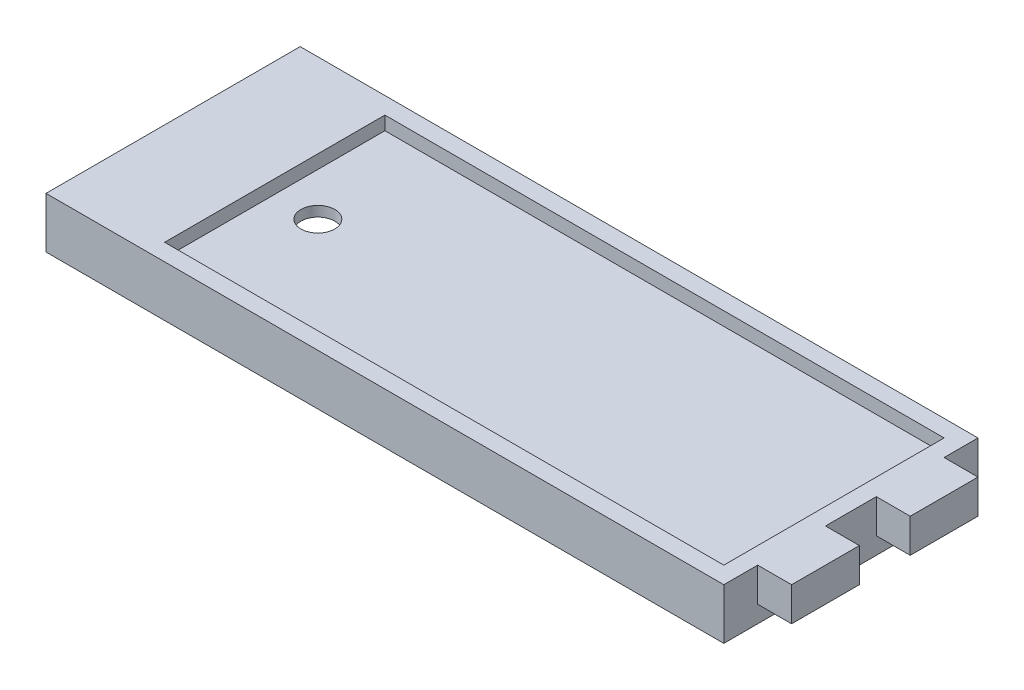
ISO-10303-21;
HEADER;
FILE_DESCRIPTION(('STEP AP214'),'2;1');
FILE_NAME('part.step','',(''),(''),'','','');
FILE_SCHEMA(('AUTOMOTIVE_DESIGN { 1 0 10303 214 1 1 1 1 }'));
ENDSEC;
DATA;
#1=APPLICATION_CONTEXT('core data for automotive mechanical design processes');
#2=APPLICATION_PROTOCOL_DEFINITION('international standard','automotive_design',2000,#1);
#3=PRODUCT_CONTEXT('',#1,'mechanical');
#4=PRODUCT('Part','Part','',(#3));
#5=PRODUCT_RELATED_PRODUCT_CATEGORY('part','',(#4));
#6=PRODUCT_DEFINITION_FORMATION('','',#4);
#7=PRODUCT_DEFINITION_CONTEXT('part definition',#1,'design');
#8=PRODUCT_DEFINITION('design','',#6,#7);
#9=PRODUCT_DEFINITION_SHAPE('','',#8);
#10=(LENGTH_UNIT() NAMED_UNIT(*) SI_UNIT(.MILLI.,.METRE.));
#11=(NAMED_UNIT(*) PLANE_ANGLE_UNIT() SI_UNIT($,.RADIAN.));
#12=(NAMED_UNIT(*) SI_UNIT($,.STERADIAN.) SOLID_ANGLE_UNIT());
#13=UNCERTAINTY_MEASURE_WITH_UNIT(LENGTH_MEASURE(1.E-05),#10,'distance_accuracy_value','');
#14=(GEOMETRIC_REPRESENTATION_CONTEXT(3) GLOBAL_UNCERTAINTY_ASSIGNED_CONTEXT((#13)) GLOBAL_UNIT_ASSIGNED_CONTEXT((#10,
#11,#12)) REPRESENTATION_CONTEXT('',''));
#15=CARTESIAN_POINT('',(0.,0.,0.));
#16=DIRECTION('',(0.,0.,1.));
#17=DIRECTION('',(1.,0.,0.));
#18=AXIS2_PLACEMENT_3D('',#15,#16,#17);
#19=CARTESIAN_POINT('',(140.,15.,-37.5));
#20=DIRECTION('',(-1.,0.,0.));
#21=DIRECTION('',(0.,0.,1.));
#22=AXIS2_PLACEMENT_3D('',#19,#20,#21);
#23=PLANE('',#22);
#24=DIRECTION('',(0.,-1.,0.));
#25=VECTOR('',#24,1.);
#26=CARTESIAN_POINT('',(140.,15.,-7.49999999999999));
#27=LINE('',#26,#25);
#28=CARTESIAN_POINT('',(140.,15.,-7.49999999999999));
#29=VERTEX_POINT('',#28);
#30=CARTESIAN_POINT('',(140.,5.,-7.49999999999999));
#31=VERTEX_POINT('',#30);
#32=EDGE_CURVE('E203',#29,#31,#27,.T.);
#33=ORIENTED_EDGE('',*,*,#32,.F.);
#34=DIRECTION('',(0.,0.,-1.));
#35=VECTOR('',#34,1.);
#36=CARTESIAN_POINT('',(140.,15.,-37.5));
#37=LINE('',#36,#35);
#38=CARTESIAN_POINT('',(140.,15.,7.50000000000001));
#39=VERTEX_POINT('',#38);
#40=EDGE_CURVE('E211',#39,#29,#37,.T.);
#41=ORIENTED_EDGE('',*,*,#40,.F.);
#42=DIRECTION('',(0.,1.,0.));
#43=VECTOR('',#42,1.);
#44=CARTESIAN_POINT('',(140.,15.,7.50000000000001));
#45=LINE('',#44,#43);
#46=CARTESIAN_POINT('',(140.,5.,7.50000000000001));
#47=VERTEX_POINT('',#46);
#48=EDGE_CURVE('E670',#47,#39,#45,.T.);
#49=ORIENTED_EDGE('',*,*,#48,.F.);
#50=DIRECTION('',(0.,0.,-1.));
#51=VECTOR('',#50,1.);
#52=CARTESIAN_POINT('',(140.,5.,27.5));
#53=LINE('',#52,#51);
#54=CARTESIAN_POINT('',(140.,5.,27.5));
#55=VERTEX_POINT('',#54);
#56=EDGE_CURVE('E71',#55,#47,#53,.T.);
#57=ORIENTED_EDGE('',*,*,#56,.F.);
#58=DIRECTION('',(0.,-1.,0.));
#59=VECTOR('',#58,1.);
#60=CARTESIAN_POINT('',(140.,15.,27.5));
#61=LINE('',#60,#59);
#62=CARTESIAN_POINT('',(140.,15.,27.5));
#63=VERTEX_POINT('',#62);
#64=EDGE_CURVE('E216',#63,#55,#61,.T.);
#65=ORIENTED_EDGE('',*,*,#64,.F.);
#66=CARTESIAN_POINT('',(140.,15.,37.5));
#67=VERTEX_POINT('',#66);
#68=EDGE_CURVE('E225',#67,#63,#37,.T.);
#69=ORIENTED_EDGE('',*,*,#68,.F.);
#70=DIRECTION('',(0.,-1.,0.));
#71=VECTOR('',#70,1.);
#72=CARTESIAN_POINT('',(140.,15.,37.5));
#73=LINE('',#72,#71);
#74=CARTESIAN_POINT('',(140.,0.,37.5));
#75=VERTEX_POINT('',#74);
#76=EDGE_CURVE('E244',#67,#75,#73,.T.);
#77=ORIENTED_EDGE('',*,*,#76,.T.);
#78=DIRECTION('',(0.,0.,-1.));
#79=VECTOR('',#78,1.);
#80=CARTESIAN_POINT('',(140.,0.,-37.5));
#81=LINE('',#80,#79);
#82=CARTESIAN_POINT('',(140.,0.,-37.5));
#83=VERTEX_POINT('',#82);
#84=EDGE_CURVE('E245',#75,#83,#81,.T.);
#85=ORIENTED_EDGE('',*,*,#84,.T.);
#86=DIRECTION('',(0.,-1.,0.));
#87=VECTOR('',#86,1.);
#88=CARTESIAN_POINT('',(140.,15.,-37.5));
#89=LINE('',#88,#87);
#90=CARTESIAN_POINT('',(140.,15.,-37.5));
#91=VERTEX_POINT('',#90);
#92=EDGE_CURVE('E11',#91,#83,#89,.T.);
#93=ORIENTED_EDGE('',*,*,#92,.F.);
#94=CARTESIAN_POINT('',(140.,15.,-27.5));
#95=VERTEX_POINT('',#94);
#96=EDGE_CURVE('E226',#95,#91,#37,.T.);
#97=ORIENTED_EDGE('',*,*,#96,.F.);
#98=DIRECTION('',(0.,1.,0.));
#99=VECTOR('',#98,1.);
#100=CARTESIAN_POINT('',(140.,15.,-27.5));
#101=LINE('',#100,#99);
#102=CARTESIAN_POINT('',(140.,5.,-27.5));
#103=VERTEX_POINT('',#102);
#104=EDGE_CURVE('E692',#103,#95,#101,.T.);
#105=ORIENTED_EDGE('',*,*,#104,.F.);
#106=DIRECTION('',(0.,0.,-1.));
#107=VECTOR('',#106,1.);
#108=CARTESIAN_POINT('',(140.,5.,-7.49999999999999));
#109=LINE('',#108,#107);
#110=EDGE_CURVE('E214',#31,#103,#109,.T.);
#111=ORIENTED_EDGE('',*,*,#110,.F.);
#112=EDGE_LOOP('',(#33,#41,#49,#57,#65,#69,#77,#85,#93,#97,#105,#111));
#113=FACE_BOUND('',#112,.T.);
#114=ADVANCED_FACE('F47',(#113),#23,.F.);
#115=CARTESIAN_POINT('',(-59.9999999999999,15.,-37.5));
#116=DIRECTION('',(0.,0.,1.));
#117=DIRECTION('',(1.,0.,0.));
#118=AXIS2_PLACEMENT_3D('',#115,#116,#117);
#119=PLANE('',#118);
#120=DIRECTION('',(-1.,0.,0.));
#121=VECTOR('',#120,1.);
#122=CARTESIAN_POINT('',(-59.9999999999999,0.,-37.5));
#123=LINE('',#122,#121);
#124=CARTESIAN_POINT('',(-59.9999999999999,0.,-37.5));
#125=VERTEX_POINT('',#124);
#126=EDGE_CURVE('E249',#83,#125,#123,.T.);
#127=ORIENTED_EDGE('',*,*,#126,.T.);
#128=DIRECTION('',(0.,-1.,0.));
#129=VECTOR('',#128,1.);
#130=CARTESIAN_POINT('',(-59.9999999999999,15.,-37.5));
#131=LINE('',#130,#129);
#132=CARTESIAN_POINT('',(-59.9999999999999,15.,-37.5));
#133=VERTEX_POINT('',#132);
#134=EDGE_CURVE('E56',#133,#125,#131,.T.);
#135=ORIENTED_EDGE('',*,*,#134,.F.);
#136=DIRECTION('',(-1.,0.,0.));
#137=VECTOR('',#136,1.);
#138=CARTESIAN_POINT('',(-59.9999999999999,15.,-37.5));
#139=LINE('',#138,#137);
#140=EDGE_CURVE('E230',#91,#133,#139,.T.);
#141=ORIENTED_EDGE('',*,*,#140,.F.);
#142=ORIENTED_EDGE('',*,*,#92,.T.);
#143=EDGE_LOOP('',(#127,#135,#141,#142));
#144=FACE_BOUND('',#143,.T.);
#145=ADVANCED_FACE('F394',(#144),#119,.F.);
#146=CARTESIAN_POINT('',(-59.9999999999999,15.,-37.5));
#147=DIRECTION('',(1.,0.,0.));
#148=DIRECTION('',(0.,0.,-1.));
#149=AXIS2_PLACEMENT_3D('',#146,#147,#148);
#150=PLANE('',#149);
#151=DIRECTION('',(0.,0.,1.));
#152=VECTOR('',#151,1.);
#153=CARTESIAN_POINT('',(-59.9999999999999,12.,-37.5));
#154=LINE('',#153,#152);
#155=CARTESIAN_POINT('',(-59.9999999999999,12.,-34.5));
#156=VERTEX_POINT('',#155);
#157=CARTESIAN_POINT('',(-59.9999999999999,12.,34.5));
#158=VERTEX_POINT('',#157);
#159=EDGE_CURVE('E645',#156,#158,#154,.T.);
#160=ORIENTED_EDGE('',*,*,#159,.T.);
#161=DIRECTION('',(0.,-1.,0.));
#162=VECTOR('',#161,1.);
#163=CARTESIAN_POINT('',(-59.9999999999999,15.,34.5));
#164=LINE('',#163,#162);
#165=CARTESIAN_POINT('',(-59.9999999999999,0.,34.5));
#166=VERTEX_POINT('',#165);
#167=EDGE_CURVE('E641',#158,#166,#164,.T.);
#168=ORIENTED_EDGE('',*,*,#167,.T.);
#169=DIRECTION('',(0.,0.,1.));
#170=VECTOR('',#169,1.);
#171=CARTESIAN_POINT('',(-59.9999999999999,0.,-37.5));
#172=LINE('',#171,#170);
#173=CARTESIAN_POINT('',(-59.9999999999999,0.,37.5));
#174=VERTEX_POINT('',#173);
#175=EDGE_CURVE('E253',#166,#174,#172,.T.);
#176=ORIENTED_EDGE('',*,*,#175,.T.);
#177=DIRECTION('',(0.,-1.,0.));
#178=VECTOR('',#177,1.);
#179=CARTESIAN_POINT('',(-59.9999999999999,15.,37.5));
#180=LINE('',#179,#178);
#181=CARTESIAN_POINT('',(-59.9999999999999,15.,37.5));
#182=VERTEX_POINT('',#181);
#183=EDGE_CURVE('E263',#182,#174,#180,.T.);
#184=ORIENTED_EDGE('',*,*,#183,.F.);
#185=DIRECTION('',(0.,0.,1.));
#186=VECTOR('',#185,1.);
#187=CARTESIAN_POINT('',(-59.9999999999999,15.,-37.5));
#188=LINE('',#187,#186);
#189=EDGE_CURVE('E238',#133,#182,#188,.T.);
#190=ORIENTED_EDGE('',*,*,#189,.F.);
#191=ORIENTED_EDGE('',*,*,#134,.T.);
#192=CARTESIAN_POINT('',(-59.9999999999999,0.,-34.5));
#193=VERTEX_POINT('',#192);
#194=EDGE_CURVE('E254',#125,#193,#172,.T.);
#195=ORIENTED_EDGE('',*,*,#194,.T.);
#196=DIRECTION('',(0.,-1.,0.));
#197=VECTOR('',#196,1.);
#198=CARTESIAN_POINT('',(-59.9999999999999,15.,-34.5));
#199=LINE('',#198,#197);
#200=EDGE_CURVE('E303',#156,#193,#199,.T.);
#201=ORIENTED_EDGE('',*,*,#200,.F.);
#202=EDGE_LOOP('',(#160,#168,#176,#184,#190,#191,#195,#201));
#203=FACE_BOUND('',#202,.T.);
#204=ADVANCED_FACE('F274',(#203),#150,.F.);
#205=CARTESIAN_POINT('',(-59.9999999999999,15.,37.5));
#206=DIRECTION('',(0.,0.,-1.));
#207=DIRECTION('',(-1.,0.,0.));
#208=AXIS2_PLACEMENT_3D('',#205,#206,#207);
#209=PLANE('',#208);
#210=DIRECTION('',(1.,0.,0.));
#211=VECTOR('',#210,1.);
#212=CARTESIAN_POINT('',(-59.9999999999999,0.,37.5));
#213=LINE('',#212,#211);
#214=EDGE_CURVE('E231',#174,#75,#213,.T.);
#215=ORIENTED_EDGE('',*,*,#214,.T.);
#216=ORIENTED_EDGE('',*,*,#76,.F.);
#217=DIRECTION('',(1.,0.,0.));
#218=VECTOR('',#217,1.);
#219=CARTESIAN_POINT('',(-59.9999999999999,15.,37.5));
#220=LINE('',#219,#218);
#221=EDGE_CURVE('E241',#182,#67,#220,.T.);
#222=ORIENTED_EDGE('',*,*,#221,.F.);
#223=ORIENTED_EDGE('',*,*,#183,.T.);
#224=EDGE_LOOP('',(#215,#216,#222,#223));
#225=FACE_BOUND('',#224,.T.);
#226=ADVANCED_FACE('F403',(#225),#209,.F.);
#227=CARTESIAN_POINT('',(0.,15.,0.));
#228=DIRECTION('',(0.,1.,0.));
#229=DIRECTION('',(0.,0.,1.));
#230=AXIS2_PLACEMENT_3D('',#227,#228,#229);
#231=PLANE('',#230);
#232=DIRECTION('',(0.,0.,1.));
#233=VECTOR('',#232,1.);
#234=CARTESIAN_POINT('',(-29.9999999999999,15.,-32.5));
#235=LINE('',#234,#233);
#236=CARTESIAN_POINT('',(-29.9999999999999,15.,-32.5));
#237=VERTEX_POINT('',#236);
#238=CARTESIAN_POINT('',(-29.9999999999999,15.,32.5));
#239=VERTEX_POINT('',#238);
#240=EDGE_CURVE('E324',#237,#239,#235,.T.);
#241=ORIENTED_EDGE('',*,*,#240,.F.);
#242=DIRECTION('',(-1.,0.,0.));
#243=VECTOR('',#242,1.);
#244=CARTESIAN_POINT('',(-29.9999999999999,15.,-32.5));
#245=LINE('',#244,#243);
#246=CARTESIAN_POINT('',(135.,15.,-32.5));
#247=VERTEX_POINT('',#246);
#248=EDGE_CURVE('E330',#247,#237,#245,.T.);
#249=ORIENTED_EDGE('',*,*,#248,.F.);
#250=DIRECTION('',(0.,0.,-1.));
#251=VECTOR('',#250,1.);
#252=CARTESIAN_POINT('',(135.,15.,-32.5));
#253=LINE('',#252,#251);
#254=CARTESIAN_POINT('',(135.,15.,32.5));
#255=VERTEX_POINT('',#254);
#256=EDGE_CURVE('E348',#255,#247,#253,.T.);
#257=ORIENTED_EDGE('',*,*,#256,.F.);
#258=DIRECTION('',(1.,0.,0.));
#259=VECTOR('',#258,1.);
#260=CARTESIAN_POINT('',(-29.9999999999999,15.,32.5));
#261=LINE('',#260,#259);
#262=EDGE_CURVE('E344',#239,#255,#261,.T.);
#263=ORIENTED_EDGE('',*,*,#262,.F.);
#264=EDGE_LOOP('',(#241,#249,#257,#263));
#265=FACE_BOUND('',#264,.T.);
#266=ORIENTED_EDGE('',*,*,#68,.T.);
#267=DIRECTION('',(-1.,0.,0.));
#268=VECTOR('',#267,1.);
#269=CARTESIAN_POINT('',(150.,15.,27.5));
#270=LINE('',#269,#268);
#271=CARTESIAN_POINT('',(150.,15.,27.5));
#272=VERTEX_POINT('',#271);
#273=EDGE_CURVE('E665',#272,#63,#270,.T.);
#274=ORIENTED_EDGE('',*,*,#273,.F.);
#275=DIRECTION('',(0.,0.,1.));
#276=VECTOR('',#275,1.);
#277=CARTESIAN_POINT('',(150.,15.,27.5));
#278=LINE('',#277,#276);
#279=CARTESIAN_POINT('',(150.,15.,7.50000000000001));
#280=VERTEX_POINT('',#279);
#281=EDGE_CURVE('E669',#280,#272,#278,.T.);
#282=ORIENTED_EDGE('',*,*,#281,.F.);
#283=DIRECTION('',(-1.,0.,0.));
#284=VECTOR('',#283,1.);
#285=CARTESIAN_POINT('',(150.,15.,7.50000000000001));
#286=LINE('',#285,#284);
#287=EDGE_CURVE('E223',#280,#39,#286,.T.);
#288=ORIENTED_EDGE('',*,*,#287,.T.);
#289=ORIENTED_EDGE('',*,*,#40,.T.);
#290=DIRECTION('',(-1.,0.,0.));
#291=VECTOR('',#290,1.);
#292=CARTESIAN_POINT('',(150.,15.,-7.49999999999999));
#293=LINE('',#292,#291);
#294=CARTESIAN_POINT('',(150.,15.,-7.49999999999999));
#295=VERTEX_POINT('',#294);
#296=EDGE_CURVE('E199',#295,#29,#293,.T.);
#297=ORIENTED_EDGE('',*,*,#296,.F.);
#298=DIRECTION('',(0.,0.,1.));
#299=VECTOR('',#298,1.);
#300=CARTESIAN_POINT('',(150.,15.,-7.49999999999999));
#301=LINE('',#300,#299);
#302=CARTESIAN_POINT('',(150.,15.,-27.5));
#303=VERTEX_POINT('',#302);
#304=EDGE_CURVE('E209',#303,#295,#301,.T.);
#305=ORIENTED_EDGE('',*,*,#304,.F.);
#306=DIRECTION('',(-1.,0.,0.));
#307=VECTOR('',#306,1.);
#308=CARTESIAN_POINT('',(150.,15.,-27.5));
#309=LINE('',#308,#307);
#310=EDGE_CURVE('E63',#303,#95,#309,.T.);
#311=ORIENTED_EDGE('',*,*,#310,.T.);
#312=ORIENTED_EDGE('',*,*,#96,.T.);
#313=ORIENTED_EDGE('',*,*,#140,.T.);
#314=ORIENTED_EDGE('',*,*,#189,.T.);
#315=ORIENTED_EDGE('',*,*,#221,.T.);
#316=EDGE_LOOP('',(#266,#274,#282,#288,#289,#297,#305,#311,#312,#313,#314,#315));
#317=FACE_BOUND('',#316,.T.);
#318=ADVANCED_FACE('F220',(#265,#317),#231,.T.);
#319=CARTESIAN_POINT('',(0.,0.,0.));
#320=DIRECTION('',(0.,1.,0.));
#321=DIRECTION('',(0.,0.,1.));
#322=AXIS2_PLACEMENT_3D('',#319,#320,#321);
#323=PLANE('',#322);
#324=ORIENTED_EDGE('',*,*,#175,.F.);
#325=DIRECTION('',(1.,0.,0.));
#326=VECTOR('',#325,1.);
#327=CARTESIAN_POINT('',(-59.9999999999999,0.,34.5));
#328=LINE('',#327,#326);
#329=CARTESIAN_POINT('',(137.,0.,34.5));
#330=VERTEX_POINT('',#329);
#331=EDGE_CURVE('E293',#166,#330,#328,.T.);
#332=ORIENTED_EDGE('',*,*,#331,.T.);
#333=DIRECTION('',(0.,0.,-1.));
#334=VECTOR('',#333,1.);
#335=CARTESIAN_POINT('',(137.,0.,-37.5));
#336=LINE('',#335,#334);
#337=CARTESIAN_POINT('',(137.,0.,-34.5));
#338=VERTEX_POINT('',#337);
#339=EDGE_CURVE('E289',#330,#338,#336,.T.);
#340=ORIENTED_EDGE('',*,*,#339,.T.);
#341=DIRECTION('',(-1.,0.,0.));
#342=VECTOR('',#341,1.);
#343=CARTESIAN_POINT('',(-59.9999999999999,0.,-34.5));
#344=LINE('',#343,#342);
#345=EDGE_CURVE('E286',#338,#193,#344,.T.);
#346=ORIENTED_EDGE('',*,*,#345,.T.);
#347=ORIENTED_EDGE('',*,*,#194,.F.);
#348=ORIENTED_EDGE('',*,*,#126,.F.);
#349=ORIENTED_EDGE('',*,*,#84,.F.);
#350=ORIENTED_EDGE('',*,*,#214,.F.);
#351=EDGE_LOOP('',(#324,#332,#340,#346,#347,#348,#349,#350));
#352=FACE_BOUND('',#351,.T.);
#353=ADVANCED_FACE('F282',(#352),#323,.F.);
#354=CARTESIAN_POINT('',(-29.9999999999999,11.,-32.5));
#355=DIRECTION('',(-1.,0.,0.));
#356=DIRECTION('',(0.,0.,1.));
#357=AXIS2_PLACEMENT_3D('',#354,#355,#356);
#358=PLANE('',#357);
#359=ORIENTED_EDGE('',*,*,#240,.T.);
#360=DIRECTION('',(0.,1.,0.));
#361=VECTOR('',#360,1.);
#362=CARTESIAN_POINT('',(-29.9999999999999,11.,32.5));
#363=LINE('',#362,#361);
#364=CARTESIAN_POINT('',(-29.9999999999999,11.,32.5));
#365=VERTEX_POINT('',#364);
#366=EDGE_CURVE('E234',#365,#239,#363,.T.);
#367=ORIENTED_EDGE('',*,*,#366,.F.);
#368=DIRECTION('',(0.,0.,1.));
#369=VECTOR('',#368,1.);
#370=CARTESIAN_POINT('',(-29.9999999999999,11.,-32.5));
#371=LINE('',#370,#369);
#372=CARTESIAN_POINT('',(-29.9999999999999,11.,-32.5));
#373=VERTEX_POINT('',#372);
#374=EDGE_CURVE('E325',#373,#365,#371,.T.);
#375=ORIENTED_EDGE('',*,*,#374,.F.);
#376=DIRECTION('',(0.,1.,0.));
#377=VECTOR('',#376,1.);
#378=CARTESIAN_POINT('',(-29.9999999999999,11.,-32.5));
#379=LINE('',#378,#377);
#380=EDGE_CURVE('E250',#373,#237,#379,.T.);
#381=ORIENTED_EDGE('',*,*,#380,.T.);
#382=EDGE_LOOP('',(#359,#367,#375,#381));
#383=FACE_BOUND('',#382,.T.);
#384=ADVANCED_FACE('F381',(#383),#358,.F.);
#385=CARTESIAN_POINT('',(-29.9999999999999,11.,-32.5));
#386=DIRECTION('',(0.,0.,-1.));
#387=DIRECTION('',(-1.,0.,0.));
#388=AXIS2_PLACEMENT_3D('',#385,#386,#387);
#389=PLANE('',#388);
#390=ORIENTED_EDGE('',*,*,#248,.T.);
#391=ORIENTED_EDGE('',*,*,#380,.F.);
#392=DIRECTION('',(-1.,0.,0.));
#393=VECTOR('',#392,1.);
#394=CARTESIAN_POINT('',(-29.9999999999999,11.,-32.5));
#395=LINE('',#394,#393);
#396=CARTESIAN_POINT('',(135.,11.,-32.5));
#397=VERTEX_POINT('',#396);
#398=EDGE_CURVE('E338',#397,#373,#395,.T.);
#399=ORIENTED_EDGE('',*,*,#398,.F.);
#400=DIRECTION('',(0.,1.,0.));
#401=VECTOR('',#400,1.);
#402=CARTESIAN_POINT('',(135.,11.,-32.5));
#403=LINE('',#402,#401);
#404=EDGE_CURVE('E357',#397,#247,#403,.T.);
#405=ORIENTED_EDGE('',*,*,#404,.T.);
#406=EDGE_LOOP('',(#390,#391,#399,#405));
#407=FACE_BOUND('',#406,.T.);
#408=ADVANCED_FACE('F380',(#407),#389,.F.);
#409=CARTESIAN_POINT('',(135.,11.,-32.5));
#410=DIRECTION('',(1.,0.,0.));
#411=DIRECTION('',(0.,0.,-1.));
#412=AXIS2_PLACEMENT_3D('',#409,#410,#411);
#413=PLANE('',#412);
#414=ORIENTED_EDGE('',*,*,#256,.T.);
#415=ORIENTED_EDGE('',*,*,#404,.F.);
#416=DIRECTION('',(0.,0.,-1.));
#417=VECTOR('',#416,1.);
#418=CARTESIAN_POINT('',(135.,11.,-32.5));
#419=LINE('',#418,#417);
#420=CARTESIAN_POINT('',(135.,11.,32.5));
#421=VERTEX_POINT('',#420);
#422=EDGE_CURVE('E334',#421,#397,#419,.T.);
#423=ORIENTED_EDGE('',*,*,#422,.F.);
#424=DIRECTION('',(0.,1.,0.));
#425=VECTOR('',#424,1.);
#426=CARTESIAN_POINT('',(135.,11.,32.5));
#427=LINE('',#426,#425);
#428=EDGE_CURVE('E359',#421,#255,#427,.T.);
#429=ORIENTED_EDGE('',*,*,#428,.T.);
#430=EDGE_LOOP('',(#414,#415,#423,#429));
#431=FACE_BOUND('',#430,.T.);
#432=ADVANCED_FACE('F375',(#431),#413,.F.);
#433=CARTESIAN_POINT('',(-29.9999999999999,11.,32.5));
#434=DIRECTION('',(0.,0.,1.));
#435=DIRECTION('',(1.,0.,0.));
#436=AXIS2_PLACEMENT_3D('',#433,#434,#435);
#437=PLANE('',#436);
#438=ORIENTED_EDGE('',*,*,#262,.T.);
#439=ORIENTED_EDGE('',*,*,#428,.F.);
#440=DIRECTION('',(1.,0.,0.));
#441=VECTOR('',#440,1.);
#442=CARTESIAN_POINT('',(-29.9999999999999,11.,32.5));
#443=LINE('',#442,#441);
#444=EDGE_CURVE('E329',#365,#421,#443,.T.);
#445=ORIENTED_EDGE('',*,*,#444,.F.);
#446=ORIENTED_EDGE('',*,*,#366,.T.);
#447=EDGE_LOOP('',(#438,#439,#445,#446));
#448=FACE_BOUND('',#447,.T.);
#449=ADVANCED_FACE('F368',(#448),#437,.F.);
#450=CARTESIAN_POINT('',(0.,11.,0.));
#451=DIRECTION('',(0.,1.,0.));
#452=DIRECTION('',(0.,0.,1.));
#453=AXIS2_PLACEMENT_3D('',#450,#451,#452);
#454=PLANE('',#453);
#455=CARTESIAN_POINT('',(-17.2823103497231,11.,0.));
#456=DIRECTION('',(0.,1.,0.));
#457=DIRECTION('',(0.,0.,1.));
#458=AXIS2_PLACEMENT_3D('',#455,#456,#457);
#459=CIRCLE('',#458,5.);
#460=CARTESIAN_POINT('',(-17.2823103497231,11.,5.));
#461=VERTEX_POINT('',#460);
#462=EDGE_CURVE('E714',#461,#461,#459,.T.);
#463=ORIENTED_EDGE('',*,*,#462,.F.);
#464=EDGE_LOOP('',(#463));
#465=FACE_BOUND('',#464,.T.);
#466=ORIENTED_EDGE('',*,*,#374,.T.);
#467=ORIENTED_EDGE('',*,*,#444,.T.);
#468=ORIENTED_EDGE('',*,*,#422,.T.);
#469=ORIENTED_EDGE('',*,*,#398,.T.);
#470=EDGE_LOOP('',(#466,#467,#468,#469));
#471=FACE_BOUND('',#470,.T.);
#472=ADVANCED_FACE('F379',(#465,#471),#454,.T.);
#473=CARTESIAN_POINT('',(-59.9999999999999,15.,-34.5));
#474=DIRECTION('',(0.,0.,1.));
#475=DIRECTION('',(1.,0.,0.));
#476=AXIS2_PLACEMENT_3D('',#473,#474,#475);
#477=PLANE('',#476);
#478=DIRECTION('',(-1.,0.,0.));
#479=VECTOR('',#478,1.);
#480=CARTESIAN_POINT('',(-59.9999999999999,8.,-34.5));
#481=LINE('',#480,#479);
#482=CARTESIAN_POINT('',(137.,8.,-34.5));
#483=VERTEX_POINT('',#482);
#484=CARTESIAN_POINT('',(-32.9999999999999,8.,-34.5));
#485=VERTEX_POINT('',#484);
#486=EDGE_CURVE('E314',#483,#485,#481,.T.);
#487=ORIENTED_EDGE('',*,*,#486,.T.);
#488=DIRECTION('',(0.,-1.,0.));
#489=VECTOR('',#488,1.);
#490=CARTESIAN_POINT('',(-32.9999999999999,15.,-34.5));
#491=LINE('',#490,#489);
#492=CARTESIAN_POINT('',(-32.9999999999999,12.,-34.5));
#493=VERTEX_POINT('',#492);
#494=EDGE_CURVE('E305',#493,#485,#491,.T.);
#495=ORIENTED_EDGE('',*,*,#494,.F.);
#496=DIRECTION('',(-1.,0.,0.));
#497=VECTOR('',#496,1.);
#498=CARTESIAN_POINT('',(-59.9999999999999,12.,-34.5));
#499=LINE('',#498,#497);
#500=EDGE_CURVE('E297',#493,#156,#499,.T.);
#501=ORIENTED_EDGE('',*,*,#500,.T.);
#502=ORIENTED_EDGE('',*,*,#200,.T.);
#503=ORIENTED_EDGE('',*,*,#345,.F.);
#504=DIRECTION('',(0.,-1.,0.));
#505=VECTOR('',#504,1.);
#506=CARTESIAN_POINT('',(137.,15.,-34.5));
#507=LINE('',#506,#505);
#508=EDGE_CURVE('E310',#483,#338,#507,.T.);
#509=ORIENTED_EDGE('',*,*,#508,.F.);
#510=EDGE_LOOP('',(#487,#495,#501,#502,#503,#509));
#511=FACE_BOUND('',#510,.T.);
#512=ADVANCED_FACE('F489',(#511),#477,.T.);
#513=CARTESIAN_POINT('',(137.,15.,-37.5));
#514=DIRECTION('',(-1.,0.,0.));
#515=DIRECTION('',(0.,0.,1.));
#516=AXIS2_PLACEMENT_3D('',#513,#514,#515);
#517=PLANE('',#516);
#518=ORIENTED_EDGE('',*,*,#508,.T.);
#519=ORIENTED_EDGE('',*,*,#339,.F.);
#520=DIRECTION('',(0.,-1.,0.));
#521=VECTOR('',#520,1.);
#522=CARTESIAN_POINT('',(137.,15.,34.5));
#523=LINE('',#522,#521);
#524=CARTESIAN_POINT('',(137.,8.,34.5));
#525=VERTEX_POINT('',#524);
#526=EDGE_CURVE('E644',#525,#330,#523,.T.);
#527=ORIENTED_EDGE('',*,*,#526,.F.);
#528=DIRECTION('',(0.,0.,1.));
#529=VECTOR('',#528,1.);
#530=CARTESIAN_POINT('',(137.,8.,0.));
#531=LINE('',#530,#529);
#532=EDGE_CURVE('E320',#483,#525,#531,.T.);
#533=ORIENTED_EDGE('',*,*,#532,.F.);
#534=EDGE_LOOP('',(#518,#519,#527,#533));
#535=FACE_BOUND('',#534,.T.);
#536=ADVANCED_FACE('F548',(#535),#517,.T.);
#537=CARTESIAN_POINT('',(-59.9999999999999,15.,34.5));
#538=DIRECTION('',(0.,0.,-1.));
#539=DIRECTION('',(-1.,0.,0.));
#540=AXIS2_PLACEMENT_3D('',#537,#538,#539);
#541=PLANE('',#540);
#542=ORIENTED_EDGE('',*,*,#526,.T.);
#543=ORIENTED_EDGE('',*,*,#331,.F.);
#544=ORIENTED_EDGE('',*,*,#167,.F.);
#545=DIRECTION('',(1.,0.,0.));
#546=VECTOR('',#545,1.);
#547=CARTESIAN_POINT('',(-59.9999999999999,12.,34.5));
#548=LINE('',#547,#546);
#549=CARTESIAN_POINT('',(-32.9999999999999,12.,34.5));
#550=VERTEX_POINT('',#549);
#551=EDGE_CURVE('E639',#158,#550,#548,.T.);
#552=ORIENTED_EDGE('',*,*,#551,.T.);
#553=DIRECTION('',(0.,-1.,0.));
#554=VECTOR('',#553,1.);
#555=CARTESIAN_POINT('',(-32.9999999999999,11.,34.5));
#556=LINE('',#555,#554);
#557=CARTESIAN_POINT('',(-32.9999999999999,8.,34.5));
#558=VERTEX_POINT('',#557);
#559=EDGE_CURVE('E309',#550,#558,#556,.T.);
#560=ORIENTED_EDGE('',*,*,#559,.T.);
#561=DIRECTION('',(-1.,0.,0.));
#562=VECTOR('',#561,1.);
#563=CARTESIAN_POINT('',(0.,8.,34.5));
#564=LINE('',#563,#562);
#565=EDGE_CURVE('E317',#525,#558,#564,.T.);
#566=ORIENTED_EDGE('',*,*,#565,.F.);
#567=EDGE_LOOP('',(#542,#543,#544,#552,#560,#566));
#568=FACE_BOUND('',#567,.T.);
#569=ADVANCED_FACE('F539',(#568),#541,.T.);
#570=CARTESIAN_POINT('',(0.,12.,0.));
#571=DIRECTION('',(0.,1.,0.));
#572=DIRECTION('',(0.,0.,1.));
#573=AXIS2_PLACEMENT_3D('',#570,#571,#572);
#574=PLANE('',#573);
#575=DIRECTION('',(0.,0.,1.));
#576=VECTOR('',#575,1.);
#577=CARTESIAN_POINT('',(-32.9999999999999,12.,0.));
#578=LINE('',#577,#576);
#579=EDGE_CURVE('E632',#493,#550,#578,.T.);
#580=ORIENTED_EDGE('',*,*,#579,.T.);
#581=ORIENTED_EDGE('',*,*,#551,.F.);
#582=ORIENTED_EDGE('',*,*,#159,.F.);
#583=ORIENTED_EDGE('',*,*,#500,.F.);
#584=EDGE_LOOP('',(#580,#581,#582,#583));
#585=FACE_BOUND('',#584,.T.);
#586=ADVANCED_FACE('F530',(#585),#574,.F.);
#587=CARTESIAN_POINT('',(-32.9999999999999,11.,-32.5));
#588=DIRECTION('',(-1.,0.,0.));
#589=DIRECTION('',(0.,0.,1.));
#590=AXIS2_PLACEMENT_3D('',#587,#588,#589);
#591=PLANE('',#590);
#592=ORIENTED_EDGE('',*,*,#579,.F.);
#593=ORIENTED_EDGE('',*,*,#494,.T.);
#594=DIRECTION('',(0.,0.,1.));
#595=VECTOR('',#594,1.);
#596=CARTESIAN_POINT('',(-32.9999999999999,8.,0.));
#597=LINE('',#596,#595);
#598=EDGE_CURVE('E299',#485,#558,#597,.T.);
#599=ORIENTED_EDGE('',*,*,#598,.T.);
#600=ORIENTED_EDGE('',*,*,#559,.F.);
#601=EDGE_LOOP('',(#592,#593,#599,#600));
#602=FACE_BOUND('',#601,.T.);
#603=ADVANCED_FACE('F500',(#602),#591,.T.);
#604=CARTESIAN_POINT('',(0.,8.,0.));
#605=DIRECTION('',(0.,1.,0.));
#606=DIRECTION('',(0.,0.,1.));
#607=AXIS2_PLACEMENT_3D('',#604,#605,#606);
#608=PLANE('',#607);
#609=CARTESIAN_POINT('',(-17.2823103497231,8.,0.));
#610=DIRECTION('',(0.,1.,0.));
#611=DIRECTION('',(0.,0.,1.));
#612=AXIS2_PLACEMENT_3D('',#609,#610,#611);
#613=CIRCLE('',#612,5.);
#614=CARTESIAN_POINT('',(-17.2823103497231,8.,5.));
#615=VERTEX_POINT('',#614);
#616=EDGE_CURVE('E50',#615,#615,#613,.T.);
#617=ORIENTED_EDGE('',*,*,#616,.T.);
#618=EDGE_LOOP('',(#617));
#619=FACE_BOUND('',#618,.T.);
#620=ORIENTED_EDGE('',*,*,#532,.T.);
#621=ORIENTED_EDGE('',*,*,#565,.T.);
#622=ORIENTED_EDGE('',*,*,#598,.F.);
#623=ORIENTED_EDGE('',*,*,#486,.F.);
#624=EDGE_LOOP('',(#620,#621,#622,#623));
#625=FACE_BOUND('',#624,.T.);
#626=ADVANCED_FACE('F418',(#619,#625),#608,.F.);
#627=CARTESIAN_POINT('',(150.,15.,27.5));
#628=DIRECTION('',(0.,0.,-1.));
#629=DIRECTION('',(-1.,0.,0.));
#630=AXIS2_PLACEMENT_3D('',#627,#628,#629);
#631=PLANE('',#630);
#632=ORIENTED_EDGE('',*,*,#64,.T.);
#633=DIRECTION('',(-1.,0.,0.));
#634=VECTOR('',#633,1.);
#635=CARTESIAN_POINT('',(150.,5.,27.5));
#636=LINE('',#635,#634);
#637=CARTESIAN_POINT('',(150.,5.,27.5));
#638=VERTEX_POINT('',#637);
#639=EDGE_CURVE('E636',#638,#55,#636,.T.);
#640=ORIENTED_EDGE('',*,*,#639,.F.);
#641=DIRECTION('',(0.,-1.,0.));
#642=VECTOR('',#641,1.);
#643=CARTESIAN_POINT('',(150.,15.,27.5));
#644=LINE('',#643,#642);
#645=EDGE_CURVE('E673',#272,#638,#644,.T.);
#646=ORIENTED_EDGE('',*,*,#645,.F.);
#647=ORIENTED_EDGE('',*,*,#273,.T.);
#648=EDGE_LOOP('',(#632,#640,#646,#647));
#649=FACE_BOUND('',#648,.T.);
#650=ADVANCED_FACE('F414',(#649),#631,.F.);
#651=CARTESIAN_POINT('',(150.,5.,27.5));
#652=DIRECTION('',(0.,1.,0.));
#653=DIRECTION('',(0.,0.,1.));
#654=AXIS2_PLACEMENT_3D('',#651,#652,#653);
#655=PLANE('',#654);
#656=ORIENTED_EDGE('',*,*,#56,.T.);
#657=DIRECTION('',(-1.,0.,0.));
#658=VECTOR('',#657,1.);
#659=CARTESIAN_POINT('',(150.,5.,7.50000000000001));
#660=LINE('',#659,#658);
#661=CARTESIAN_POINT('',(150.,5.,7.50000000000001));
#662=VERTEX_POINT('',#661);
#663=EDGE_CURVE('E659',#662,#47,#660,.T.);
#664=ORIENTED_EDGE('',*,*,#663,.F.);
#665=DIRECTION('',(0.,0.,-1.));
#666=VECTOR('',#665,1.);
#667=CARTESIAN_POINT('',(150.,5.,27.5));
#668=LINE('',#667,#666);
#669=EDGE_CURVE('E684',#638,#662,#668,.T.);
#670=ORIENTED_EDGE('',*,*,#669,.F.);
#671=ORIENTED_EDGE('',*,*,#639,.T.);
#672=EDGE_LOOP('',(#656,#664,#670,#671));
#673=FACE_BOUND('',#672,.T.);
#674=ADVANCED_FACE('F417',(#673),#655,.F.);
#675=CARTESIAN_POINT('',(150.,15.,7.50000000000001));
#676=DIRECTION('',(0.,0.,1.));
#677=DIRECTION('',(0.,-1.,0.));
#678=AXIS2_PLACEMENT_3D('',#675,#676,#677);
#679=PLANE('',#678);
#680=ORIENTED_EDGE('',*,*,#48,.T.);
#681=ORIENTED_EDGE('',*,*,#287,.F.);
#682=DIRECTION('',(0.,1.,0.));
#683=VECTOR('',#682,1.);
#684=CARTESIAN_POINT('',(150.,15.,7.50000000000001));
#685=LINE('',#684,#683);
#686=EDGE_CURVE('E681',#662,#280,#685,.T.);
#687=ORIENTED_EDGE('',*,*,#686,.F.);
#688=ORIENTED_EDGE('',*,*,#663,.T.);
#689=EDGE_LOOP('',(#680,#681,#687,#688));
#690=FACE_BOUND('',#689,.T.);
#691=ADVANCED_FACE('F427',(#690),#679,.F.);
#692=CARTESIAN_POINT('',(150.,0.,0.));
#693=DIRECTION('',(1.,0.,0.));
#694=DIRECTION('',(0.,0.,-1.));
#695=AXIS2_PLACEMENT_3D('',#692,#693,#694);
#696=PLANE('',#695);
#697=ORIENTED_EDGE('',*,*,#645,.T.);
#698=ORIENTED_EDGE('',*,*,#669,.T.);
#699=ORIENTED_EDGE('',*,*,#686,.T.);
#700=ORIENTED_EDGE('',*,*,#281,.T.);
#701=EDGE_LOOP('',(#697,#698,#699,#700));
#702=FACE_BOUND('',#701,.T.);
#703=ADVANCED_FACE('F436',(#702),#696,.T.);
#704=CARTESIAN_POINT('',(150.,15.,-7.49999999999999));
#705=DIRECTION('',(0.,0.,-1.));
#706=DIRECTION('',(0.,1.,0.));
#707=AXIS2_PLACEMENT_3D('',#704,#705,#706);
#708=PLANE('',#707);
#709=ORIENTED_EDGE('',*,*,#32,.T.);
#710=DIRECTION('',(-1.,0.,0.));
#711=VECTOR('',#710,1.);
#712=CARTESIAN_POINT('',(150.,5.,-7.49999999999999));
#713=LINE('',#712,#711);
#714=CARTESIAN_POINT('',(150.,5.,-7.49999999999999));
#715=VERTEX_POINT('',#714);
#716=EDGE_CURVE('E711',#715,#31,#713,.T.);
#717=ORIENTED_EDGE('',*,*,#716,.F.);
#718=DIRECTION('',(0.,-1.,0.));
#719=VECTOR('',#718,1.);
#720=CARTESIAN_POINT('',(150.,15.,-7.49999999999999));
#721=LINE('',#720,#719);
#722=EDGE_CURVE('E206',#295,#715,#721,.T.);
#723=ORIENTED_EDGE('',*,*,#722,.F.);
#724=ORIENTED_EDGE('',*,*,#296,.T.);
#725=EDGE_LOOP('',(#709,#717,#723,#724));
#726=FACE_BOUND('',#725,.T.);
#727=ADVANCED_FACE('F201',(#726),#708,.F.);
#728=CARTESIAN_POINT('',(150.,5.,-7.49999999999999));
#729=DIRECTION('',(0.,1.,0.));
#730=DIRECTION('',(0.,0.,1.));
#731=AXIS2_PLACEMENT_3D('',#728,#729,#730);
#732=PLANE('',#731);
#733=ORIENTED_EDGE('',*,*,#110,.T.);
#734=DIRECTION('',(-1.,0.,0.));
#735=VECTOR('',#734,1.);
#736=CARTESIAN_POINT('',(150.,5.,-27.5));
#737=LINE('',#736,#735);
#738=CARTESIAN_POINT('',(150.,5.,-27.5));
#739=VERTEX_POINT('',#738);
#740=EDGE_CURVE('E707',#739,#103,#737,.T.);
#741=ORIENTED_EDGE('',*,*,#740,.F.);
#742=DIRECTION('',(0.,0.,-1.));
#743=VECTOR('',#742,1.);
#744=CARTESIAN_POINT('',(150.,5.,-7.49999999999999));
#745=LINE('',#744,#743);
#746=EDGE_CURVE('E693',#715,#739,#745,.T.);
#747=ORIENTED_EDGE('',*,*,#746,.F.);
#748=ORIENTED_EDGE('',*,*,#716,.T.);
#749=EDGE_LOOP('',(#733,#741,#747,#748));
#750=FACE_BOUND('',#749,.T.);
#751=ADVANCED_FACE('F453',(#750),#732,.F.);
#752=CARTESIAN_POINT('',(150.,15.,-27.5));
#753=DIRECTION('',(0.,0.,1.));
#754=DIRECTION('',(1.,0.,0.));
#755=AXIS2_PLACEMENT_3D('',#752,#753,#754);
#756=PLANE('',#755);
#757=ORIENTED_EDGE('',*,*,#104,.T.);
#758=ORIENTED_EDGE('',*,*,#310,.F.);
#759=DIRECTION('',(0.,1.,0.));
#760=VECTOR('',#759,1.);
#761=CARTESIAN_POINT('',(150.,15.,-27.5));
#762=LINE('',#761,#760);
#763=EDGE_CURVE('E696',#739,#303,#762,.T.);
#764=ORIENTED_EDGE('',*,*,#763,.F.);
#765=ORIENTED_EDGE('',*,*,#740,.T.);
#766=EDGE_LOOP('',(#757,#758,#764,#765));
#767=FACE_BOUND('',#766,.T.);
#768=ADVANCED_FACE('F461',(#767),#756,.F.);
#769=CARTESIAN_POINT('',(150.,0.,0.));
#770=DIRECTION('',(1.,0.,0.));
#771=DIRECTION('',(0.,0.,-1.));
#772=AXIS2_PLACEMENT_3D('',#769,#770,#771);
#773=PLANE('',#772);
#774=ORIENTED_EDGE('',*,*,#722,.T.);
#775=ORIENTED_EDGE('',*,*,#746,.T.);
#776=ORIENTED_EDGE('',*,*,#763,.T.);
#777=ORIENTED_EDGE('',*,*,#304,.T.);
#778=EDGE_LOOP('',(#774,#775,#776,#777));
#779=FACE_BOUND('',#778,.T.);
#780=ADVANCED_FACE('F470',(#779),#773,.T.);
#781=CARTESIAN_POINT('',(-17.2823103497231,0.,0.));
#782=DIRECTION('',(0.,1.,0.));
#783=DIRECTION('',(0.,0.,1.));
#784=AXIS2_PLACEMENT_3D('',#781,#782,#783);
#785=CYLINDRICAL_SURFACE('',#784,5.);
#786=ORIENTED_EDGE('',*,*,#462,.T.);
#787=EDGE_LOOP('',(#786));
#788=FACE_BOUND('',#787,.T.);
#789=ORIENTED_EDGE('',*,*,#616,.F.);
#790=EDGE_LOOP('',(#789));
#791=FACE_BOUND('',#790,.T.);
#792=ADVANCED_FACE('F479',(#788,#791),#785,.F.);
#793=CLOSED_SHELL('',(#114,#145,#204,#226,#318,#353,#384,#408,#432,#449,#472,#512,#536,#569,
#586,#603,#626,#650,#674,#691,#703,#727,#751,#768,#780,#792));
#794=MANIFOLD_SOLID_BREP('B2',#793);
#795=ADVANCED_BREP_SHAPE_REPRESENTATION('',(#18,#794),#14);
#796=SHAPE_DEFINITION_REPRESENTATION(#9,#795);
ENDSEC;
END-ISO-10303-21;
